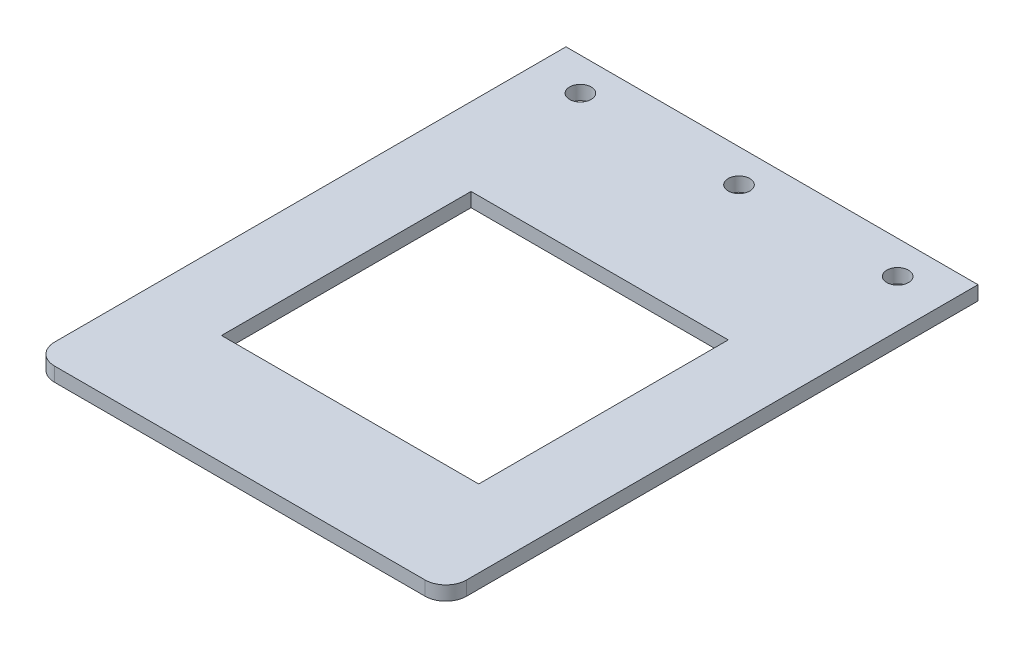
ISO-10303-21;
HEADER;
FILE_DESCRIPTION(('STEP AP214'),'2;1');
FILE_NAME('part.step','',(''),(''),'','','');
FILE_SCHEMA(('AUTOMOTIVE_DESIGN { 1 0 10303 214 1 1 1 1 }'));
ENDSEC;
DATA;
#1=APPLICATION_CONTEXT('core data for automotive mechanical design processes');
#2=APPLICATION_PROTOCOL_DEFINITION('international standard','automotive_design',2000,#1);
#3=PRODUCT_CONTEXT('',#1,'mechanical');
#4=PRODUCT('Part','Part','',(#3));
#5=PRODUCT_RELATED_PRODUCT_CATEGORY('part','',(#4));
#6=PRODUCT_DEFINITION_FORMATION('','',#4);
#7=PRODUCT_DEFINITION_CONTEXT('part definition',#1,'design');
#8=PRODUCT_DEFINITION('design','',#6,#7);
#9=PRODUCT_DEFINITION_SHAPE('','',#8);
#10=(LENGTH_UNIT() NAMED_UNIT(*) SI_UNIT(.MILLI.,.METRE.));
#11=(NAMED_UNIT(*) PLANE_ANGLE_UNIT() SI_UNIT($,.RADIAN.));
#12=(NAMED_UNIT(*) SI_UNIT($,.STERADIAN.) SOLID_ANGLE_UNIT());
#13=UNCERTAINTY_MEASURE_WITH_UNIT(LENGTH_MEASURE(1.E-05),#10,'distance_accuracy_value','');
#14=(GEOMETRIC_REPRESENTATION_CONTEXT(3) GLOBAL_UNCERTAINTY_ASSIGNED_CONTEXT((#13)) GLOBAL_UNIT_ASSIGNED_CONTEXT((#10,
#11,#12)) REPRESENTATION_CONTEXT('',''));
#15=CARTESIAN_POINT('',(0.,0.,0.));
#16=DIRECTION('',(0.,0.,1.));
#17=DIRECTION('',(1.,0.,0.));
#18=AXIS2_PLACEMENT_3D('',#15,#16,#17);
#19=CARTESIAN_POINT('',(16.3453458771444,1.5,25.8117796019595));
#20=DIRECTION('',(0.,-1.,0.));
#21=DIRECTION('',(0.,0.,-1.));
#22=AXIS2_PLACEMENT_3D('',#19,#20,#21);
#23=PLANE('',#22);
#24=CARTESIAN_POINT('',(13.5150734450869,1.5,-24.9832203980405));
#25=DIRECTION('',(0.,1.,0.));
#26=DIRECTION('',(0.,0.,1.));
#27=AXIS2_PLACEMENT_3D('',#24,#25,#26);
#28=CIRCLE('',#27,1.15);
#29=CARTESIAN_POINT('',(13.5150734450869,1.5,-23.8332203980405));
#30=VERTEX_POINT('',#29);
#31=EDGE_CURVE('E195',#30,#30,#28,.T.);
#32=ORIENTED_EDGE('',*,*,#31,.F.);
#33=EDGE_LOOP('',(#32));
#34=FACE_BOUND('',#33,.T.);
#35=CARTESIAN_POINT('',(-3.32492655491308,1.5,-24.9832203980405));
#36=DIRECTION('',(0.,1.,0.));
#37=DIRECTION('',(0.,0.,1.));
#38=AXIS2_PLACEMENT_3D('',#35,#36,#37);
#39=CIRCLE('',#38,1.15);
#40=CARTESIAN_POINT('',(-3.32492655491308,1.5,-23.8332203980405));
#41=VERTEX_POINT('',#40);
#42=EDGE_CURVE('E203',#41,#41,#39,.T.);
#43=ORIENTED_EDGE('',*,*,#42,.F.);
#44=EDGE_LOOP('',(#43));
#45=FACE_BOUND('',#44,.T.);
#46=CARTESIAN_POINT('',(-20.1649265549131,1.5,-24.9832203980405));
#47=DIRECTION('',(0.,1.,0.));
#48=DIRECTION('',(0.,0.,1.));
#49=AXIS2_PLACEMENT_3D('',#46,#47,#48);
#50=CIRCLE('',#49,1.15);
#51=CARTESIAN_POINT('',(-20.1649265549131,1.5,-23.8332203980405));
#52=VERTEX_POINT('',#51);
#53=EDGE_CURVE('E211',#52,#52,#50,.T.);
#54=ORIENTED_EDGE('',*,*,#53,.F.);
#55=EDGE_LOOP('',(#54));
#56=FACE_BOUND('',#55,.T.);
#57=DIRECTION('',(-1.,0.,0.));
#58=VECTOR('',#57,1.);
#59=CARTESIAN_POINT('',(10.3670792984,1.5,-10.1491412547806));
#60=LINE('',#59,#58);
#61=CARTESIAN_POINT('',(10.3670792984,1.5,-10.1491412547806));
#62=VERTEX_POINT('',#61);
#63=CARTESIAN_POINT('',(-16.9379207016,1.5,-10.1491412547806));
#64=VERTEX_POINT('',#63);
#65=EDGE_CURVE('E219',#62,#64,#60,.T.);
#66=ORIENTED_EDGE('',*,*,#65,.F.);
#67=DIRECTION('',(0.,0.,-1.));
#68=VECTOR('',#67,1.);
#69=CARTESIAN_POINT('',(10.3670792984,1.5,16.3428587452194));
#70=LINE('',#69,#68);
#71=CARTESIAN_POINT('',(10.3670792984,1.5,16.3428587452194));
#72=VERTEX_POINT('',#71);
#73=EDGE_CURVE('E229',#72,#62,#70,.T.);
#74=ORIENTED_EDGE('',*,*,#73,.F.);
#75=DIRECTION('',(1.,0.,0.));
#76=VECTOR('',#75,1.);
#77=CARTESIAN_POINT('',(-16.9379207016,1.5,16.3428587452194));
#78=LINE('',#77,#76);
#79=CARTESIAN_POINT('',(-16.9379207016,1.5,16.3428587452194));
#80=VERTEX_POINT('',#79);
#81=EDGE_CURVE('E226',#80,#72,#78,.T.);
#82=ORIENTED_EDGE('',*,*,#81,.F.);
#83=DIRECTION('',(0.,0.,1.));
#84=VECTOR('',#83,1.);
#85=CARTESIAN_POINT('',(-16.9379207016,1.5,-10.1491412547806));
#86=LINE('',#85,#84);
#87=EDGE_CURVE('E222',#64,#80,#86,.T.);
#88=ORIENTED_EDGE('',*,*,#87,.F.);
#89=EDGE_LOOP('',(#66,#74,#82,#88));
#90=FACE_BOUND('',#89,.T.);
#91=DIRECTION('',(-1.,0.,0.));
#92=VECTOR('',#91,1.);
#93=CARTESIAN_POINT('',(-25.1936541228556,1.5,-28.4832203980405));
#94=LINE('',#93,#92);
#95=CARTESIAN_POINT('',(18.5453458771444,1.5,-28.4832203980405));
#96=VERTEX_POINT('',#95);
#97=CARTESIAN_POINT('',(-25.1936541228556,1.5,-28.4832203980405));
#98=VERTEX_POINT('',#97);
#99=EDGE_CURVE('E260',#96,#98,#94,.T.);
#100=ORIENTED_EDGE('',*,*,#99,.T.);
#101=DIRECTION('',(0.,0.,1.));
#102=VECTOR('',#101,1.);
#103=CARTESIAN_POINT('',(-25.1936541228556,1.5,23.3117796019595));
#104=LINE('',#103,#102);
#105=CARTESIAN_POINT('',(-25.1936541228556,1.5,25.8117796019595));
#106=VERTEX_POINT('',#105);
#107=EDGE_CURVE('E264',#98,#106,#104,.T.);
#108=ORIENTED_EDGE('',*,*,#107,.T.);
#109=CARTESIAN_POINT('',(-22.9936541228556,1.5,25.8117796019595));
#110=DIRECTION('',(0.,1.,0.));
#111=DIRECTION('',(0.,0.,1.));
#112=AXIS2_PLACEMENT_3D('',#109,#110,#111);
#113=CIRCLE('',#112,2.2);
#114=CARTESIAN_POINT('',(-22.9936541228556,1.5,28.0117796019595));
#115=VERTEX_POINT('',#114);
#116=EDGE_CURVE('E268',#106,#115,#113,.T.);
#117=ORIENTED_EDGE('',*,*,#116,.T.);
#118=DIRECTION('',(1.,0.,0.));
#119=VECTOR('',#118,1.);
#120=CARTESIAN_POINT('',(-22.9936541228556,1.5,28.0117796019595));
#121=LINE('',#120,#119);
#122=CARTESIAN_POINT('',(16.3453458771444,1.5,28.0117796019595));
#123=VERTEX_POINT('',#122);
#124=EDGE_CURVE('E271',#115,#123,#121,.T.);
#125=ORIENTED_EDGE('',*,*,#124,.T.);
#126=CARTESIAN_POINT('',(16.3453458771444,1.5,25.8117796019595));
#127=DIRECTION('',(0.,1.,0.));
#128=DIRECTION('',(0.,0.,-1.));
#129=AXIS2_PLACEMENT_3D('',#126,#127,#128);
#130=CIRCLE('',#129,2.2);
#131=CARTESIAN_POINT('',(18.5453458771444,1.5,25.8117796019595));
#132=VERTEX_POINT('',#131);
#133=EDGE_CURVE('E274',#123,#132,#130,.T.);
#134=ORIENTED_EDGE('',*,*,#133,.T.);
#135=DIRECTION('',(0.,0.,-1.));
#136=VECTOR('',#135,1.);
#137=CARTESIAN_POINT('',(18.5453458771444,1.5,24.5117796019595));
#138=LINE('',#137,#136);
#139=EDGE_CURVE('E277',#132,#96,#138,.T.);
#140=ORIENTED_EDGE('',*,*,#139,.T.);
#141=EDGE_LOOP('',(#100,#108,#117,#125,#134,#140));
#142=FACE_BOUND('',#141,.T.);
#143=ADVANCED_FACE('F41',(#34,#45,#56,#90,#142),#23,.F.);
#144=CARTESIAN_POINT('',(16.3453458771444,0.,25.8117796019595));
#145=DIRECTION('',(0.,-1.,0.));
#146=DIRECTION('',(0.,0.,-1.));
#147=AXIS2_PLACEMENT_3D('',#144,#145,#146);
#148=PLANE('',#147);
#149=DIRECTION('',(0.,0.,1.));
#150=VECTOR('',#149,1.);
#151=CARTESIAN_POINT('',(-9.28713256607591,0.,0.));
#152=LINE('',#151,#150);
#153=CARTESIAN_POINT('',(-9.28713256607591,0.,-18.4324214776686));
#154=VERTEX_POINT('',#153);
#155=CARTESIAN_POINT('',(-9.28713256607591,0.,-14.6854214776686));
#156=VERTEX_POINT('',#155);
#157=EDGE_CURVE('E151',#154,#156,#152,.T.);
#158=ORIENTED_EDGE('',*,*,#157,.T.);
#159=DIRECTION('',(-1.,0.,0.));
#160=VECTOR('',#159,1.);
#161=CARTESIAN_POINT('',(0.,0.,-14.6854214776686));
#162=LINE('',#161,#160);
#163=CARTESIAN_POINT('',(7.95386743392409,0.,-14.6854214776686));
#164=VERTEX_POINT('',#163);
#165=EDGE_CURVE('E171',#164,#156,#162,.T.);
#166=ORIENTED_EDGE('',*,*,#165,.F.);
#167=DIRECTION('',(0.,0.,1.));
#168=VECTOR('',#167,1.);
#169=CARTESIAN_POINT('',(7.95386743392409,0.,0.));
#170=LINE('',#169,#168);
#171=CARTESIAN_POINT('',(7.95386743392409,0.,-18.4324214776686));
#172=VERTEX_POINT('',#171);
#173=EDGE_CURVE('E174',#172,#164,#170,.T.);
#174=ORIENTED_EDGE('',*,*,#173,.F.);
#175=DIRECTION('',(1.,0.,0.));
#176=VECTOR('',#175,1.);
#177=CARTESIAN_POINT('',(0.,0.,-18.4324214776686));
#178=LINE('',#177,#176);
#179=EDGE_CURVE('E184',#154,#172,#178,.T.);
#180=ORIENTED_EDGE('',*,*,#179,.F.);
#181=EDGE_LOOP('',(#158,#166,#174,#180));
#182=FACE_BOUND('',#181,.T.);
#183=CARTESIAN_POINT('',(-3.32492655491308,0.,-24.9832203980405));
#184=DIRECTION('',(0.,1.,0.));
#185=DIRECTION('',(0.,0.,1.));
#186=AXIS2_PLACEMENT_3D('',#183,#184,#185);
#187=CIRCLE('',#186,1.15);
#188=CARTESIAN_POINT('',(-3.32492655491308,0.,-23.8332203980405));
#189=VERTEX_POINT('',#188);
#190=EDGE_CURVE('E199',#189,#189,#187,.T.);
#191=ORIENTED_EDGE('',*,*,#190,.T.);
#192=EDGE_LOOP('',(#191));
#193=FACE_BOUND('',#192,.T.);
#194=DIRECTION('',(0.,0.,-1.));
#195=VECTOR('',#194,1.);
#196=CARTESIAN_POINT('',(10.3670792984,0.,16.3428587452194));
#197=LINE('',#196,#195);
#198=CARTESIAN_POINT('',(10.3670792984,0.,16.3428587452194));
#199=VERTEX_POINT('',#198);
#200=CARTESIAN_POINT('',(10.3670792984,0.,-10.1491412547806));
#201=VERTEX_POINT('',#200);
#202=EDGE_CURVE('E223',#199,#201,#197,.T.);
#203=ORIENTED_EDGE('',*,*,#202,.T.);
#204=DIRECTION('',(-1.,0.,0.));
#205=VECTOR('',#204,1.);
#206=CARTESIAN_POINT('',(10.3670792984,0.,-10.1491412547806));
#207=LINE('',#206,#205);
#208=CARTESIAN_POINT('',(-16.9379207016,0.,-10.1491412547806));
#209=VERTEX_POINT('',#208);
#210=EDGE_CURVE('E215',#201,#209,#207,.T.);
#211=ORIENTED_EDGE('',*,*,#210,.T.);
#212=DIRECTION('',(0.,0.,1.));
#213=VECTOR('',#212,1.);
#214=CARTESIAN_POINT('',(-16.9379207016,0.,-10.1491412547806));
#215=LINE('',#214,#213);
#216=CARTESIAN_POINT('',(-16.9379207016,0.,16.3428587452194));
#217=VERTEX_POINT('',#216);
#218=EDGE_CURVE('E236',#209,#217,#215,.T.);
#219=ORIENTED_EDGE('',*,*,#218,.T.);
#220=DIRECTION('',(1.,0.,0.));
#221=VECTOR('',#220,1.);
#222=CARTESIAN_POINT('',(-16.9379207016,0.,16.3428587452194));
#223=LINE('',#222,#221);
#224=EDGE_CURVE('E240',#217,#199,#223,.T.);
#225=ORIENTED_EDGE('',*,*,#224,.T.);
#226=EDGE_LOOP('',(#203,#211,#219,#225));
#227=FACE_BOUND('',#226,.T.);
#228=DIRECTION('',(-1.,0.,0.));
#229=VECTOR('',#228,1.);
#230=CARTESIAN_POINT('',(-25.1936541228556,0.,-28.4832203980405));
#231=LINE('',#230,#229);
#232=CARTESIAN_POINT('',(18.5453458771444,0.,-28.4832203980405));
#233=VERTEX_POINT('',#232);
#234=CARTESIAN_POINT('',(-25.1936541228556,0.,-28.4832203980405));
#235=VERTEX_POINT('',#234);
#236=EDGE_CURVE('E259',#233,#235,#231,.T.);
#237=ORIENTED_EDGE('',*,*,#236,.F.);
#238=DIRECTION('',(0.,0.,-1.));
#239=VECTOR('',#238,1.);
#240=CARTESIAN_POINT('',(18.5453458771444,0.,-28.4832203980405));
#241=LINE('',#240,#239);
#242=CARTESIAN_POINT('',(18.5453458771444,0.,25.8117796019595));
#243=VERTEX_POINT('',#242);
#244=EDGE_CURVE('E265',#243,#233,#241,.T.);
#245=ORIENTED_EDGE('',*,*,#244,.F.);
#246=CARTESIAN_POINT('',(16.3453458771444,0.,25.8117796019595));
#247=DIRECTION('',(0.,1.,0.));
#248=DIRECTION('',(0.,0.,-1.));
#249=AXIS2_PLACEMENT_3D('',#246,#247,#248);
#250=CIRCLE('',#249,2.2);
#251=CARTESIAN_POINT('',(16.3453458771444,0.,28.0117796019595));
#252=VERTEX_POINT('',#251);
#253=EDGE_CURVE('E293',#252,#243,#250,.T.);
#254=ORIENTED_EDGE('',*,*,#253,.F.);
#255=DIRECTION('',(1.,0.,0.));
#256=VECTOR('',#255,1.);
#257=CARTESIAN_POINT('',(-22.9936541228556,0.,28.0117796019595));
#258=LINE('',#257,#256);
#259=CARTESIAN_POINT('',(-22.9936541228556,0.,28.0117796019595));
#260=VERTEX_POINT('',#259);
#261=EDGE_CURVE('E290',#260,#252,#258,.T.);
#262=ORIENTED_EDGE('',*,*,#261,.F.);
#263=CARTESIAN_POINT('',(-22.9936541228556,0.,25.8117796019595));
#264=DIRECTION('',(0.,1.,0.));
#265=DIRECTION('',(0.,0.,1.));
#266=AXIS2_PLACEMENT_3D('',#263,#264,#265);
#267=CIRCLE('',#266,2.2);
#268=CARTESIAN_POINT('',(-25.1936541228556,0.,25.8117796019595));
#269=VERTEX_POINT('',#268);
#270=EDGE_CURVE('E287',#269,#260,#267,.T.);
#271=ORIENTED_EDGE('',*,*,#270,.F.);
#272=DIRECTION('',(0.,0.,1.));
#273=VECTOR('',#272,1.);
#274=CARTESIAN_POINT('',(-25.1936541228556,0.,24.5117796019595));
#275=LINE('',#274,#273);
#276=EDGE_CURVE('E284',#235,#269,#275,.T.);
#277=ORIENTED_EDGE('',*,*,#276,.F.);
#278=EDGE_LOOP('',(#237,#245,#254,#262,#271,#277));
#279=FACE_BOUND('',#278,.T.);
#280=CARTESIAN_POINT('',(-20.1649265549131,0.,-24.9832203980405));
#281=DIRECTION('',(0.,1.,0.));
#282=DIRECTION('',(0.,0.,1.));
#283=AXIS2_PLACEMENT_3D('',#280,#281,#282);
#284=CIRCLE('',#283,1.15);
#285=CARTESIAN_POINT('',(-20.1649265549131,0.,-23.8332203980405));
#286=VERTEX_POINT('',#285);
#287=EDGE_CURVE('E207',#286,#286,#284,.T.);
#288=ORIENTED_EDGE('',*,*,#287,.T.);
#289=EDGE_LOOP('',(#288));
#290=FACE_BOUND('',#289,.T.);
#291=CARTESIAN_POINT('',(13.5150734450869,0.,-24.9832203980405));
#292=DIRECTION('',(0.,1.,0.));
#293=DIRECTION('',(0.,0.,1.));
#294=AXIS2_PLACEMENT_3D('',#291,#292,#293);
#295=CIRCLE('',#294,1.15);
#296=CARTESIAN_POINT('',(13.5150734450869,0.,-23.8332203980405));
#297=VERTEX_POINT('',#296);
#298=EDGE_CURVE('E155',#297,#297,#295,.T.);
#299=ORIENTED_EDGE('',*,*,#298,.T.);
#300=EDGE_LOOP('',(#299));
#301=FACE_BOUND('',#300,.T.);
#302=ADVANCED_FACE('F325',(#182,#193,#227,#279,#290,#301),#148,.T.);
#303=CARTESIAN_POINT('',(-25.1936541228556,1.5,-28.4832203980405));
#304=DIRECTION('',(0.,0.,1.));
#305=DIRECTION('',(1.,0.,0.));
#306=AXIS2_PLACEMENT_3D('',#303,#304,#305);
#307=PLANE('',#306);
#308=ORIENTED_EDGE('',*,*,#236,.T.);
#309=DIRECTION('',(0.,-1.,0.));
#310=VECTOR('',#309,1.);
#311=CARTESIAN_POINT('',(-25.1936541228556,1.5,-28.4832203980405));
#312=LINE('',#311,#310);
#313=EDGE_CURVE('E11',#98,#235,#312,.T.);
#314=ORIENTED_EDGE('',*,*,#313,.F.);
#315=ORIENTED_EDGE('',*,*,#99,.F.);
#316=DIRECTION('',(0.,-1.,0.));
#317=VECTOR('',#316,1.);
#318=CARTESIAN_POINT('',(18.5453458771444,1.5,-28.4832203980405));
#319=LINE('',#318,#317);
#320=EDGE_CURVE('E280',#96,#233,#319,.T.);
#321=ORIENTED_EDGE('',*,*,#320,.T.);
#322=EDGE_LOOP('',(#308,#314,#315,#321));
#323=FACE_BOUND('',#322,.T.);
#324=ADVANCED_FACE('F43',(#323),#307,.F.);
#325=CARTESIAN_POINT('',(-25.1936541228556,1.5,24.5117796019595));
#326=DIRECTION('',(1.,0.,0.));
#327=DIRECTION('',(0.,0.,-1.));
#328=AXIS2_PLACEMENT_3D('',#325,#326,#327);
#329=PLANE('',#328);
#330=ORIENTED_EDGE('',*,*,#276,.T.);
#331=DIRECTION('',(0.,-1.,0.));
#332=VECTOR('',#331,1.);
#333=CARTESIAN_POINT('',(-25.1936541228556,1.5,25.8117796019595));
#334=LINE('',#333,#332);
#335=EDGE_CURVE('E50',#106,#269,#334,.T.);
#336=ORIENTED_EDGE('',*,*,#335,.F.);
#337=ORIENTED_EDGE('',*,*,#107,.F.);
#338=ORIENTED_EDGE('',*,*,#313,.T.);
#339=EDGE_LOOP('',(#330,#336,#337,#338));
#340=FACE_BOUND('',#339,.T.);
#341=ADVANCED_FACE('F341',(#340),#329,.F.);
#342=CARTESIAN_POINT('',(-22.9936541228556,1.5,25.8117796019595));
#343=DIRECTION('',(0.,-1.,0.));
#344=DIRECTION('',(0.,0.,-1.));
#345=AXIS2_PLACEMENT_3D('',#342,#343,#344);
#346=CYLINDRICAL_SURFACE('',#345,2.2);
#347=ORIENTED_EDGE('',*,*,#270,.T.);
#348=DIRECTION('',(0.,-1.,0.));
#349=VECTOR('',#348,1.);
#350=CARTESIAN_POINT('',(-22.9936541228556,1.5,28.0117796019595));
#351=LINE('',#350,#349);
#352=EDGE_CURVE('E310',#115,#260,#351,.T.);
#353=ORIENTED_EDGE('',*,*,#352,.F.);
#354=ORIENTED_EDGE('',*,*,#116,.F.);
#355=ORIENTED_EDGE('',*,*,#335,.T.);
#356=EDGE_LOOP('',(#347,#353,#354,#355));
#357=FACE_BOUND('',#356,.T.);
#358=ADVANCED_FACE('F319',(#357),#346,.T.);
#359=CARTESIAN_POINT('',(-22.9936541228556,1.5,28.0117796019595));
#360=DIRECTION('',(0.,0.,-1.));
#361=DIRECTION('',(-1.,0.,0.));
#362=AXIS2_PLACEMENT_3D('',#359,#360,#361);
#363=PLANE('',#362);
#364=ORIENTED_EDGE('',*,*,#261,.T.);
#365=DIRECTION('',(0.,-1.,0.));
#366=VECTOR('',#365,1.);
#367=CARTESIAN_POINT('',(16.3453458771444,1.5,28.0117796019595));
#368=LINE('',#367,#366);
#369=EDGE_CURVE('E306',#123,#252,#368,.T.);
#370=ORIENTED_EDGE('',*,*,#369,.F.);
#371=ORIENTED_EDGE('',*,*,#124,.F.);
#372=ORIENTED_EDGE('',*,*,#352,.T.);
#373=EDGE_LOOP('',(#364,#370,#371,#372));
#374=FACE_BOUND('',#373,.T.);
#375=ADVANCED_FACE('F330',(#374),#363,.F.);
#376=CARTESIAN_POINT('',(16.3453458771444,1.5,25.8117796019595));
#377=DIRECTION('',(0.,-1.,0.));
#378=DIRECTION('',(0.,0.,-1.));
#379=AXIS2_PLACEMENT_3D('',#376,#377,#378);
#380=CYLINDRICAL_SURFACE('',#379,2.2);
#381=ORIENTED_EDGE('',*,*,#253,.T.);
#382=DIRECTION('',(0.,-1.,0.));
#383=VECTOR('',#382,1.);
#384=CARTESIAN_POINT('',(18.5453458771444,1.5,25.8117796019595));
#385=LINE('',#384,#383);
#386=EDGE_CURVE('E302',#132,#243,#385,.T.);
#387=ORIENTED_EDGE('',*,*,#386,.F.);
#388=ORIENTED_EDGE('',*,*,#133,.F.);
#389=ORIENTED_EDGE('',*,*,#369,.T.);
#390=EDGE_LOOP('',(#381,#387,#388,#389));
#391=FACE_BOUND('',#390,.T.);
#392=ADVANCED_FACE('F334',(#391),#380,.T.);
#393=CARTESIAN_POINT('',(18.5453458771444,1.5,-28.4832203980405));
#394=DIRECTION('',(-1.,0.,0.));
#395=DIRECTION('',(0.,0.,1.));
#396=AXIS2_PLACEMENT_3D('',#393,#394,#395);
#397=PLANE('',#396);
#398=ORIENTED_EDGE('',*,*,#244,.T.);
#399=ORIENTED_EDGE('',*,*,#320,.F.);
#400=ORIENTED_EDGE('',*,*,#139,.F.);
#401=ORIENTED_EDGE('',*,*,#386,.T.);
#402=EDGE_LOOP('',(#398,#399,#400,#401));
#403=FACE_BOUND('',#402,.T.);
#404=ADVANCED_FACE('F344',(#403),#397,.F.);
#405=CARTESIAN_POINT('',(10.3670792984,1.5,-10.1491412547806));
#406=DIRECTION('',(0.,0.,1.));
#407=DIRECTION('',(1.,0.,0.));
#408=AXIS2_PLACEMENT_3D('',#405,#406,#407);
#409=PLANE('',#408);
#410=ORIENTED_EDGE('',*,*,#210,.F.);
#411=DIRECTION('',(0.,-1.,0.));
#412=VECTOR('',#411,1.);
#413=CARTESIAN_POINT('',(10.3670792984,1.5,-10.1491412547806));
#414=LINE('',#413,#412);
#415=EDGE_CURVE('E232',#62,#201,#414,.T.);
#416=ORIENTED_EDGE('',*,*,#415,.F.);
#417=ORIENTED_EDGE('',*,*,#65,.T.);
#418=DIRECTION('',(0.,-1.,0.));
#419=VECTOR('',#418,1.);
#420=CARTESIAN_POINT('',(-16.9379207016,1.5,-10.1491412547806));
#421=LINE('',#420,#419);
#422=EDGE_CURVE('E255',#64,#209,#421,.T.);
#423=ORIENTED_EDGE('',*,*,#422,.T.);
#424=EDGE_LOOP('',(#410,#416,#417,#423));
#425=FACE_BOUND('',#424,.T.);
#426=ADVANCED_FACE('F346',(#425),#409,.T.);
#427=CARTESIAN_POINT('',(-16.9379207016,1.5,-10.1491412547806));
#428=DIRECTION('',(1.,0.,0.));
#429=DIRECTION('',(0.,0.,-1.));
#430=AXIS2_PLACEMENT_3D('',#427,#428,#429);
#431=PLANE('',#430);
#432=ORIENTED_EDGE('',*,*,#218,.F.);
#433=ORIENTED_EDGE('',*,*,#422,.F.);
#434=ORIENTED_EDGE('',*,*,#87,.T.);
#435=DIRECTION('',(0.,-1.,0.));
#436=VECTOR('',#435,1.);
#437=CARTESIAN_POINT('',(-16.9379207016,1.5,16.3428587452194));
#438=LINE('',#437,#436);
#439=EDGE_CURVE('E252',#80,#217,#438,.T.);
#440=ORIENTED_EDGE('',*,*,#439,.T.);
#441=EDGE_LOOP('',(#432,#433,#434,#440));
#442=FACE_BOUND('',#441,.T.);
#443=ADVANCED_FACE('F352',(#442),#431,.T.);
#444=CARTESIAN_POINT('',(-16.9379207016,1.5,16.3428587452194));
#445=DIRECTION('',(0.,0.,-1.));
#446=DIRECTION('',(-1.,0.,0.));
#447=AXIS2_PLACEMENT_3D('',#444,#445,#446);
#448=PLANE('',#447);
#449=ORIENTED_EDGE('',*,*,#224,.F.);
#450=ORIENTED_EDGE('',*,*,#439,.F.);
#451=ORIENTED_EDGE('',*,*,#81,.T.);
#452=DIRECTION('',(0.,-1.,0.));
#453=VECTOR('',#452,1.);
#454=CARTESIAN_POINT('',(10.3670792984,1.5,16.3428587452194));
#455=LINE('',#454,#453);
#456=EDGE_CURVE('E65',#72,#199,#455,.T.);
#457=ORIENTED_EDGE('',*,*,#456,.T.);
#458=EDGE_LOOP('',(#449,#450,#451,#457));
#459=FACE_BOUND('',#458,.T.);
#460=ADVANCED_FACE('F369',(#459),#448,.T.);
#461=CARTESIAN_POINT('',(10.3670792984,1.5,16.3428587452194));
#462=DIRECTION('',(-1.,0.,0.));
#463=DIRECTION('',(0.,0.,1.));
#464=AXIS2_PLACEMENT_3D('',#461,#462,#463);
#465=PLANE('',#464);
#466=ORIENTED_EDGE('',*,*,#202,.F.);
#467=ORIENTED_EDGE('',*,*,#456,.F.);
#468=ORIENTED_EDGE('',*,*,#73,.T.);
#469=ORIENTED_EDGE('',*,*,#415,.T.);
#470=EDGE_LOOP('',(#466,#467,#468,#469));
#471=FACE_BOUND('',#470,.T.);
#472=ADVANCED_FACE('F373',(#471),#465,.T.);
#473=CARTESIAN_POINT('',(-20.1649265549131,1.5,-24.9832203980405));
#474=DIRECTION('',(0.,-1.,0.));
#475=DIRECTION('',(0.,0.,-1.));
#476=AXIS2_PLACEMENT_3D('',#473,#474,#475);
#477=CYLINDRICAL_SURFACE('',#476,1.15);
#478=ORIENTED_EDGE('',*,*,#53,.T.);
#479=EDGE_LOOP('',(#478));
#480=FACE_BOUND('',#479,.T.);
#481=ORIENTED_EDGE('',*,*,#287,.F.);
#482=EDGE_LOOP('',(#481));
#483=FACE_BOUND('',#482,.T.);
#484=ADVANCED_FACE('F377',(#480,#483),#477,.F.);
#485=CARTESIAN_POINT('',(-3.32492655491308,1.5,-24.9832203980405));
#486=DIRECTION('',(0.,-1.,0.));
#487=DIRECTION('',(0.,0.,-1.));
#488=AXIS2_PLACEMENT_3D('',#485,#486,#487);
#489=CYLINDRICAL_SURFACE('',#488,1.15);
#490=ORIENTED_EDGE('',*,*,#42,.T.);
#491=EDGE_LOOP('',(#490));
#492=FACE_BOUND('',#491,.T.);
#493=ORIENTED_EDGE('',*,*,#190,.F.);
#494=EDGE_LOOP('',(#493));
#495=FACE_BOUND('',#494,.T.);
#496=ADVANCED_FACE('F380',(#492,#495),#489,.F.);
#497=CARTESIAN_POINT('',(13.5150734450869,1.5,-24.9832203980405));
#498=DIRECTION('',(0.,-1.,0.));
#499=DIRECTION('',(0.,0.,-1.));
#500=AXIS2_PLACEMENT_3D('',#497,#498,#499);
#501=CYLINDRICAL_SURFACE('',#500,1.15);
#502=ORIENTED_EDGE('',*,*,#31,.T.);
#503=EDGE_LOOP('',(#502));
#504=FACE_BOUND('',#503,.T.);
#505=ORIENTED_EDGE('',*,*,#298,.F.);
#506=EDGE_LOOP('',(#505));
#507=FACE_BOUND('',#506,.T.);
#508=ADVANCED_FACE('F384',(#504,#507),#501,.F.);
#509=CARTESIAN_POINT('',(-9.28713256607591,-3.,0.));
#510=DIRECTION('',(-1.,0.,0.));
#511=DIRECTION('',(0.,0.,1.));
#512=AXIS2_PLACEMENT_3D('',#509,#510,#511);
#513=PLANE('',#512);
#514=ORIENTED_EDGE('',*,*,#157,.F.);
#515=DIRECTION('',(0.,1.,0.));
#516=VECTOR('',#515,1.);
#517=CARTESIAN_POINT('',(-9.28713256607591,-3.,-18.4324214776686));
#518=LINE('',#517,#516);
#519=CARTESIAN_POINT('',(-9.28713256607591,-3.,-18.4324214776686));
#520=VERTEX_POINT('',#519);
#521=EDGE_CURVE('E145',#520,#154,#518,.T.);
#522=ORIENTED_EDGE('',*,*,#521,.F.);
#523=DIRECTION('',(0.,0.,1.));
#524=VECTOR('',#523,1.);
#525=CARTESIAN_POINT('',(-9.28713256607591,-3.,0.));
#526=LINE('',#525,#524);
#527=CARTESIAN_POINT('',(-9.28713256607591,-3.,-14.6854214776686));
#528=VERTEX_POINT('',#527);
#529=EDGE_CURVE('E149',#520,#528,#526,.T.);
#530=ORIENTED_EDGE('',*,*,#529,.T.);
#531=DIRECTION('',(0.,1.,0.));
#532=VECTOR('',#531,1.);
#533=CARTESIAN_POINT('',(-9.28713256607591,-3.,-14.6854214776686));
#534=LINE('',#533,#532);
#535=EDGE_CURVE('E181',#528,#156,#534,.T.);
#536=ORIENTED_EDGE('',*,*,#535,.T.);
#537=EDGE_LOOP('',(#514,#522,#530,#536));
#538=FACE_BOUND('',#537,.T.);
#539=ADVANCED_FACE('F147',(#538),#513,.T.);
#540=CARTESIAN_POINT('',(0.,-3.,-18.4324214776686));
#541=DIRECTION('',(0.,0.,1.));
#542=DIRECTION('',(1.,0.,0.));
#543=AXIS2_PLACEMENT_3D('',#540,#541,#542);
#544=PLANE('',#543);
#545=ORIENTED_EDGE('',*,*,#179,.T.);
#546=DIRECTION('',(0.,1.,0.));
#547=VECTOR('',#546,1.);
#548=CARTESIAN_POINT('',(7.95386743392409,-3.,-18.4324214776686));
#549=LINE('',#548,#547);
#550=CARTESIAN_POINT('',(7.95386743392409,-3.,-18.4324214776686));
#551=VERTEX_POINT('',#550);
#552=EDGE_CURVE('E156',#551,#172,#549,.T.);
#553=ORIENTED_EDGE('',*,*,#552,.F.);
#554=DIRECTION('',(1.,0.,0.));
#555=VECTOR('',#554,1.);
#556=CARTESIAN_POINT('',(0.,-3.,-18.4324214776686));
#557=LINE('',#556,#555);
#558=EDGE_CURVE('E159',#520,#551,#557,.T.);
#559=ORIENTED_EDGE('',*,*,#558,.F.);
#560=ORIENTED_EDGE('',*,*,#521,.T.);
#561=EDGE_LOOP('',(#545,#553,#559,#560));
#562=FACE_BOUND('',#561,.T.);
#563=ADVANCED_FACE('F160',(#562),#544,.F.);
#564=CARTESIAN_POINT('',(7.95386743392409,-3.,0.));
#565=DIRECTION('',(-1.,0.,0.));
#566=DIRECTION('',(0.,0.,1.));
#567=AXIS2_PLACEMENT_3D('',#564,#565,#566);
#568=PLANE('',#567);
#569=ORIENTED_EDGE('',*,*,#173,.T.);
#570=DIRECTION('',(0.,1.,0.));
#571=VECTOR('',#570,1.);
#572=CARTESIAN_POINT('',(7.95386743392409,-3.,-14.6854214776686));
#573=LINE('',#572,#571);
#574=CARTESIAN_POINT('',(7.95386743392409,-3.,-14.6854214776686));
#575=VERTEX_POINT('',#574);
#576=EDGE_CURVE('E57',#575,#164,#573,.T.);
#577=ORIENTED_EDGE('',*,*,#576,.F.);
#578=DIRECTION('',(0.,0.,1.));
#579=VECTOR('',#578,1.);
#580=CARTESIAN_POINT('',(7.95386743392409,-3.,0.));
#581=LINE('',#580,#579);
#582=EDGE_CURVE('E165',#551,#575,#581,.T.);
#583=ORIENTED_EDGE('',*,*,#582,.F.);
#584=ORIENTED_EDGE('',*,*,#552,.T.);
#585=EDGE_LOOP('',(#569,#577,#583,#584));
#586=FACE_BOUND('',#585,.T.);
#587=ADVANCED_FACE('F393',(#586),#568,.F.);
#588=CARTESIAN_POINT('',(0.,-3.,-14.6854214776686));
#589=DIRECTION('',(0.,0.,-1.));
#590=DIRECTION('',(-1.,0.,0.));
#591=AXIS2_PLACEMENT_3D('',#588,#589,#590);
#592=PLANE('',#591);
#593=ORIENTED_EDGE('',*,*,#165,.T.);
#594=ORIENTED_EDGE('',*,*,#535,.F.);
#595=DIRECTION('',(-1.,0.,0.));
#596=VECTOR('',#595,1.);
#597=CARTESIAN_POINT('',(0.,-3.,-14.6854214776686));
#598=LINE('',#597,#596);
#599=EDGE_CURVE('E168',#575,#528,#598,.T.);
#600=ORIENTED_EDGE('',*,*,#599,.F.);
#601=ORIENTED_EDGE('',*,*,#576,.T.);
#602=EDGE_LOOP('',(#593,#594,#600,#601));
#603=FACE_BOUND('',#602,.T.);
#604=ADVANCED_FACE('F396',(#603),#592,.F.);
#605=CARTESIAN_POINT('',(0.,-3.,0.));
#606=DIRECTION('',(0.,-1.,0.));
#607=DIRECTION('',(0.,0.,-1.));
#608=AXIS2_PLACEMENT_3D('',#605,#606,#607);
#609=PLANE('',#608);
#610=ORIENTED_EDGE('',*,*,#529,.F.);
#611=ORIENTED_EDGE('',*,*,#558,.T.);
#612=ORIENTED_EDGE('',*,*,#582,.T.);
#613=ORIENTED_EDGE('',*,*,#599,.T.);
#614=EDGE_LOOP('',(#610,#611,#612,#613));
#615=FACE_BOUND('',#614,.T.);
#616=ADVANCED_FACE('F167',(#615),#609,.T.);
#617=CLOSED_SHELL('',(#143,#302,#324,#341,#358,#375,#392,#404,#426,#443,#460,#472,#484,#496,
#508,#539,#563,#587,#604,#616));
#618=MANIFOLD_SOLID_BREP('B2',#617);
#619=ADVANCED_BREP_SHAPE_REPRESENTATION('',(#18,#618),#14);
#620=SHAPE_DEFINITION_REPRESENTATION(#9,#619);
ENDSEC;
END-ISO-10303-21;
